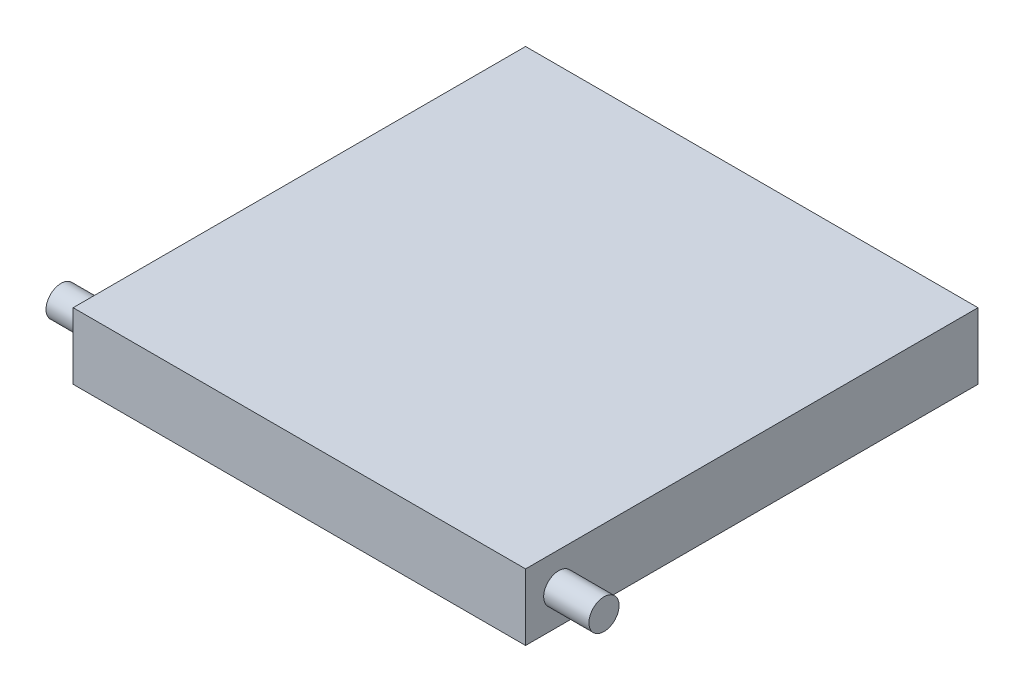
ISO-10303-21;
HEADER;
FILE_DESCRIPTION(('STEP AP214'),'2;1');
FILE_NAME('part.step','',(''),(''),'','','');
FILE_SCHEMA(('AUTOMOTIVE_DESIGN { 1 0 10303 214 1 1 1 1 }'));
ENDSEC;
DATA;
#1=APPLICATION_CONTEXT('core data for automotive mechanical design processes');
#2=APPLICATION_PROTOCOL_DEFINITION('international standard','automotive_design',2000,#1);
#3=PRODUCT_CONTEXT('',#1,'mechanical');
#4=PRODUCT('Part','Part','',(#3));
#5=PRODUCT_RELATED_PRODUCT_CATEGORY('part','',(#4));
#6=PRODUCT_DEFINITION_FORMATION('','',#4);
#7=PRODUCT_DEFINITION_CONTEXT('part definition',#1,'design');
#8=PRODUCT_DEFINITION('design','',#6,#7);
#9=PRODUCT_DEFINITION_SHAPE('','',#8);
#10=(LENGTH_UNIT() NAMED_UNIT(*) SI_UNIT(.MILLI.,.METRE.));
#11=(NAMED_UNIT(*) PLANE_ANGLE_UNIT() SI_UNIT($,.RADIAN.));
#12=(NAMED_UNIT(*) SI_UNIT($,.STERADIAN.) SOLID_ANGLE_UNIT());
#13=UNCERTAINTY_MEASURE_WITH_UNIT(LENGTH_MEASURE(1.E-05),#10,'distance_accuracy_value','');
#14=(GEOMETRIC_REPRESENTATION_CONTEXT(3) GLOBAL_UNCERTAINTY_ASSIGNED_CONTEXT((#13)) GLOBAL_UNIT_ASSIGNED_CONTEXT((#10,
#11,#12)) REPRESENTATION_CONTEXT('',''));
#15=CARTESIAN_POINT('',(0.,0.,0.));
#16=DIRECTION('',(0.,0.,1.));
#17=DIRECTION('',(1.,0.,0.));
#18=AXIS2_PLACEMENT_3D('',#15,#16,#17);
#19=CARTESIAN_POINT('',(75.,22.,75.));
#20=DIRECTION('',(-1.,0.,0.));
#21=DIRECTION('',(0.,0.,1.));
#22=AXIS2_PLACEMENT_3D('',#19,#20,#21);
#23=PLANE('',#22);
#24=CARTESIAN_POINT('',(75.,11.,64.));
#25=DIRECTION('',(-1.,0.,0.));
#26=DIRECTION('',(0.,0.,1.));
#27=AXIS2_PLACEMENT_3D('',#24,#25,#26);
#28=CIRCLE('',#27,5.);
#29=CARTESIAN_POINT('',(75.,11.,69.));
#30=VERTEX_POINT('',#29);
#31=EDGE_CURVE('E42',#30,#30,#28,.F.);
#32=ORIENTED_EDGE('',*,*,#31,.F.);
#33=EDGE_LOOP('',(#32));
#34=FACE_BOUND('',#33,.T.);
#35=DIRECTION('',(0.,0.,-1.));
#36=VECTOR('',#35,1.);
#37=CARTESIAN_POINT('',(75.,0.,75.));
#38=LINE('',#37,#36);
#39=CARTESIAN_POINT('',(75.,0.,75.));
#40=VERTEX_POINT('',#39);
#41=CARTESIAN_POINT('',(75.,0.,-75.));
#42=VERTEX_POINT('',#41);
#43=EDGE_CURVE('E101',#40,#42,#38,.T.);
#44=ORIENTED_EDGE('',*,*,#43,.T.);
#45=DIRECTION('',(0.,-1.,0.));
#46=VECTOR('',#45,1.);
#47=CARTESIAN_POINT('',(75.,22.,-75.));
#48=LINE('',#47,#46);
#49=CARTESIAN_POINT('',(75.,22.,-75.));
#50=VERTEX_POINT('',#49);
#51=EDGE_CURVE('E92',#50,#42,#48,.T.);
#52=ORIENTED_EDGE('',*,*,#51,.F.);
#53=DIRECTION('',(0.,0.,-1.));
#54=VECTOR('',#53,1.);
#55=CARTESIAN_POINT('',(75.,22.,75.));
#56=LINE('',#55,#54);
#57=CARTESIAN_POINT('',(75.,22.,75.));
#58=VERTEX_POINT('',#57);
#59=EDGE_CURVE('E86',#58,#50,#56,.T.);
#60=ORIENTED_EDGE('',*,*,#59,.F.);
#61=DIRECTION('',(0.,-1.,0.));
#62=VECTOR('',#61,1.);
#63=CARTESIAN_POINT('',(75.,22.,75.));
#64=LINE('',#63,#62);
#65=EDGE_CURVE('E97',#58,#40,#64,.T.);
#66=ORIENTED_EDGE('',*,*,#65,.T.);
#67=EDGE_LOOP('',(#44,#52,#60,#66));
#68=FACE_BOUND('',#67,.T.);
#69=ADVANCED_FACE('F34',(#34,#68),#23,.F.);
#70=CARTESIAN_POINT('',(-75.,22.,-75.));
#71=DIRECTION('',(0.,0.,1.));
#72=DIRECTION('',(1.,0.,0.));
#73=AXIS2_PLACEMENT_3D('',#70,#71,#72);
#74=PLANE('',#73);
#75=DIRECTION('',(-1.,0.,0.));
#76=VECTOR('',#75,1.);
#77=CARTESIAN_POINT('',(-75.,0.,-75.));
#78=LINE('',#77,#76);
#79=CARTESIAN_POINT('',(-75.,0.,-75.));
#80=VERTEX_POINT('',#79);
#81=EDGE_CURVE('E91',#42,#80,#78,.T.);
#82=ORIENTED_EDGE('',*,*,#81,.T.);
#83=DIRECTION('',(0.,-1.,0.));
#84=VECTOR('',#83,1.);
#85=CARTESIAN_POINT('',(-75.,22.,-75.));
#86=LINE('',#85,#84);
#87=CARTESIAN_POINT('',(-75.,22.,-75.));
#88=VERTEX_POINT('',#87);
#89=EDGE_CURVE('E89',#88,#80,#86,.T.);
#90=ORIENTED_EDGE('',*,*,#89,.F.);
#91=DIRECTION('',(-1.,0.,0.));
#92=VECTOR('',#91,1.);
#93=CARTESIAN_POINT('',(-75.,22.,-75.));
#94=LINE('',#93,#92);
#95=EDGE_CURVE('E81',#50,#88,#94,.T.);
#96=ORIENTED_EDGE('',*,*,#95,.F.);
#97=ORIENTED_EDGE('',*,*,#51,.T.);
#98=EDGE_LOOP('',(#82,#90,#96,#97));
#99=FACE_BOUND('',#98,.T.);
#100=ADVANCED_FACE('F90',(#99),#74,.F.);
#101=CARTESIAN_POINT('',(-75.,22.,75.));
#102=DIRECTION('',(1.,0.,0.));
#103=DIRECTION('',(0.,0.,-1.));
#104=AXIS2_PLACEMENT_3D('',#101,#102,#103);
#105=PLANE('',#104);
#106=CARTESIAN_POINT('',(-75.,11.,64.));
#107=DIRECTION('',(1.,0.,0.));
#108=DIRECTION('',(0.,0.,-1.));
#109=AXIS2_PLACEMENT_3D('',#106,#107,#108);
#110=CIRCLE('',#109,5.);
#111=CARTESIAN_POINT('',(-75.,11.,59.));
#112=VERTEX_POINT('',#111);
#113=EDGE_CURVE('E11',#112,#112,#110,.F.);
#114=ORIENTED_EDGE('',*,*,#113,.F.);
#115=EDGE_LOOP('',(#114));
#116=FACE_BOUND('',#115,.T.);
#117=DIRECTION('',(0.,0.,1.));
#118=VECTOR('',#117,1.);
#119=CARTESIAN_POINT('',(-75.,0.,75.));
#120=LINE('',#119,#118);
#121=CARTESIAN_POINT('',(-75.,0.,75.));
#122=VERTEX_POINT('',#121);
#123=EDGE_CURVE('E67',#80,#122,#120,.T.);
#124=ORIENTED_EDGE('',*,*,#123,.T.);
#125=DIRECTION('',(0.,-1.,0.));
#126=VECTOR('',#125,1.);
#127=CARTESIAN_POINT('',(-75.,22.,75.));
#128=LINE('',#127,#126);
#129=CARTESIAN_POINT('',(-75.,22.,75.));
#130=VERTEX_POINT('',#129);
#131=EDGE_CURVE('E93',#130,#122,#128,.T.);
#132=ORIENTED_EDGE('',*,*,#131,.F.);
#133=DIRECTION('',(0.,0.,1.));
#134=VECTOR('',#133,1.);
#135=CARTESIAN_POINT('',(-75.,22.,75.));
#136=LINE('',#135,#134);
#137=EDGE_CURVE('E84',#88,#130,#136,.T.);
#138=ORIENTED_EDGE('',*,*,#137,.F.);
#139=ORIENTED_EDGE('',*,*,#89,.T.);
#140=EDGE_LOOP('',(#124,#132,#138,#139));
#141=FACE_BOUND('',#140,.T.);
#142=ADVANCED_FACE('F95',(#116,#141),#105,.F.);
#143=CARTESIAN_POINT('',(-75.,22.,75.));
#144=DIRECTION('',(0.,0.,-1.));
#145=DIRECTION('',(-1.,0.,0.));
#146=AXIS2_PLACEMENT_3D('',#143,#144,#145);
#147=PLANE('',#146);
#148=DIRECTION('',(1.,0.,0.));
#149=VECTOR('',#148,1.);
#150=CARTESIAN_POINT('',(-75.,0.,75.));
#151=LINE('',#150,#149);
#152=EDGE_CURVE('E73',#122,#40,#151,.T.);
#153=ORIENTED_EDGE('',*,*,#152,.T.);
#154=ORIENTED_EDGE('',*,*,#65,.F.);
#155=DIRECTION('',(1.,0.,0.));
#156=VECTOR('',#155,1.);
#157=CARTESIAN_POINT('',(-75.,22.,75.));
#158=LINE('',#157,#156);
#159=EDGE_CURVE('E50',#130,#58,#158,.T.);
#160=ORIENTED_EDGE('',*,*,#159,.F.);
#161=ORIENTED_EDGE('',*,*,#131,.T.);
#162=EDGE_LOOP('',(#153,#154,#160,#161));
#163=FACE_BOUND('',#162,.T.);
#164=ADVANCED_FACE('F129',(#163),#147,.F.);
#165=CARTESIAN_POINT('',(0.,22.,0.));
#166=DIRECTION('',(0.,-1.,0.));
#167=DIRECTION('',(0.,0.,-1.));
#168=AXIS2_PLACEMENT_3D('',#165,#166,#167);
#169=PLANE('',#168);
#170=ORIENTED_EDGE('',*,*,#59,.T.);
#171=ORIENTED_EDGE('',*,*,#95,.T.);
#172=ORIENTED_EDGE('',*,*,#137,.T.);
#173=ORIENTED_EDGE('',*,*,#159,.T.);
#174=EDGE_LOOP('',(#170,#171,#172,#173));
#175=FACE_BOUND('',#174,.T.);
#176=ADVANCED_FACE('F82',(#175),#169,.F.);
#177=CARTESIAN_POINT('',(0.,0.,0.));
#178=DIRECTION('',(0.,-1.,0.));
#179=DIRECTION('',(0.,0.,-1.));
#180=AXIS2_PLACEMENT_3D('',#177,#178,#179);
#181=PLANE('',#180);
#182=ORIENTED_EDGE('',*,*,#43,.F.);
#183=ORIENTED_EDGE('',*,*,#152,.F.);
#184=ORIENTED_EDGE('',*,*,#123,.F.);
#185=ORIENTED_EDGE('',*,*,#81,.F.);
#186=EDGE_LOOP('',(#182,#183,#184,#185));
#187=FACE_BOUND('',#186,.T.);
#188=ADVANCED_FACE('F119',(#187),#181,.T.);
#189=CARTESIAN_POINT('',(90.,11.,64.));
#190=DIRECTION('',(-1.,0.,0.));
#191=DIRECTION('',(0.,0.,1.));
#192=AXIS2_PLACEMENT_3D('',#189,#190,#191);
#193=CYLINDRICAL_SURFACE('',#192,5.);
#194=CARTESIAN_POINT('',(90.,11.,64.));
#195=DIRECTION('',(1.,0.,0.));
#196=DIRECTION('',(0.,0.,-1.));
#197=AXIS2_PLACEMENT_3D('',#194,#195,#196);
#198=CIRCLE('',#197,5.);
#199=CARTESIAN_POINT('',(90.,11.,59.));
#200=VERTEX_POINT('',#199);
#201=EDGE_CURVE('E104',#200,#200,#198,.T.);
#202=ORIENTED_EDGE('',*,*,#201,.F.);
#203=EDGE_LOOP('',(#202));
#204=FACE_BOUND('',#203,.T.);
#205=ORIENTED_EDGE('',*,*,#31,.T.);
#206=EDGE_LOOP('',(#205));
#207=FACE_BOUND('',#206,.T.);
#208=ADVANCED_FACE('F113',(#204,#207),#193,.T.);
#209=CARTESIAN_POINT('',(90.,0.,0.));
#210=DIRECTION('',(1.,0.,0.));
#211=DIRECTION('',(0.,0.,-1.));
#212=AXIS2_PLACEMENT_3D('',#209,#210,#211);
#213=PLANE('',#212);
#214=ORIENTED_EDGE('',*,*,#201,.T.);
#215=EDGE_LOOP('',(#214));
#216=FACE_BOUND('',#215,.T.);
#217=ADVANCED_FACE('F126',(#216),#213,.T.);
#218=CARTESIAN_POINT('',(-90.,11.,64.));
#219=DIRECTION('',(1.,0.,0.));
#220=DIRECTION('',(0.,0.,-1.));
#221=AXIS2_PLACEMENT_3D('',#218,#219,#220);
#222=CYLINDRICAL_SURFACE('',#221,5.);
#223=CARTESIAN_POINT('',(-90.,11.,64.));
#224=DIRECTION('',(-1.,0.,0.));
#225=DIRECTION('',(0.,0.,1.));
#226=AXIS2_PLACEMENT_3D('',#223,#224,#225);
#227=CIRCLE('',#226,5.);
#228=CARTESIAN_POINT('',(-90.,11.,69.));
#229=VERTEX_POINT('',#228);
#230=EDGE_CURVE('E203',#229,#229,#227,.T.);
#231=ORIENTED_EDGE('',*,*,#230,.F.);
#232=EDGE_LOOP('',(#231));
#233=FACE_BOUND('',#232,.T.);
#234=ORIENTED_EDGE('',*,*,#113,.T.);
#235=EDGE_LOOP('',(#234));
#236=FACE_BOUND('',#235,.T.);
#237=ADVANCED_FACE('F177',(#233,#236),#222,.T.);
#238=CARTESIAN_POINT('',(-90.,11.,64.));
#239=DIRECTION('',(-1.,0.,0.));
#240=DIRECTION('',(0.,0.,1.));
#241=AXIS2_PLACEMENT_3D('',#238,#239,#240);
#242=PLANE('',#241);
#243=ORIENTED_EDGE('',*,*,#230,.T.);
#244=EDGE_LOOP('',(#243));
#245=FACE_BOUND('',#244,.T.);
#246=ADVANCED_FACE('F187',(#245),#242,.T.);
#247=CLOSED_SHELL('',(#69,#100,#142,#164,#176,#188,#208,#217,#237,#246));
#248=MANIFOLD_SOLID_BREP('B2',#247);
#249=ADVANCED_BREP_SHAPE_REPRESENTATION('',(#18,#248),#14);
#250=SHAPE_DEFINITION_REPRESENTATION(#9,#249);
ENDSEC;
END-ISO-10303-21;
